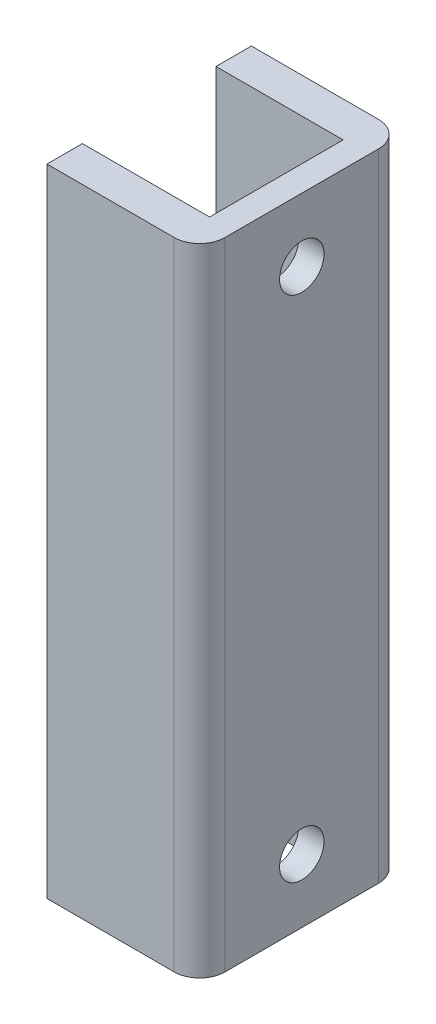
ISO-10303-21;
HEADER;
FILE_DESCRIPTION(('STEP AP214'),'2;1');
FILE_NAME('part.step','',(''),(''),'','','');
FILE_SCHEMA(('AUTOMOTIVE_DESIGN { 1 0 10303 214 1 1 1 1 }'));
ENDSEC;
DATA;
#1=APPLICATION_CONTEXT('core data for automotive mechanical design processes');
#2=APPLICATION_PROTOCOL_DEFINITION('international standard','automotive_design',2000,#1);
#3=PRODUCT_CONTEXT('',#1,'mechanical');
#4=PRODUCT('Part','Part','',(#3));
#5=PRODUCT_RELATED_PRODUCT_CATEGORY('part','',(#4));
#6=PRODUCT_DEFINITION_FORMATION('','',#4);
#7=PRODUCT_DEFINITION_CONTEXT('part definition',#1,'design');
#8=PRODUCT_DEFINITION('design','',#6,#7);
#9=PRODUCT_DEFINITION_SHAPE('','',#8);
#10=(LENGTH_UNIT() NAMED_UNIT(*) SI_UNIT(.MILLI.,.METRE.));
#11=(NAMED_UNIT(*) PLANE_ANGLE_UNIT() SI_UNIT($,.RADIAN.));
#12=(NAMED_UNIT(*) SI_UNIT($,.STERADIAN.) SOLID_ANGLE_UNIT());
#13=UNCERTAINTY_MEASURE_WITH_UNIT(LENGTH_MEASURE(1.E-05),#10,'distance_accuracy_value','');
#14=(GEOMETRIC_REPRESENTATION_CONTEXT(3) GLOBAL_UNCERTAINTY_ASSIGNED_CONTEXT((#13)) GLOBAL_UNIT_ASSIGNED_CONTEXT((#10,
#11,#12)) REPRESENTATION_CONTEXT('',''));
#15=CARTESIAN_POINT('',(0.,0.,0.));
#16=DIRECTION('',(0.,0.,1.));
#17=DIRECTION('',(1.,0.,0.));
#18=AXIS2_PLACEMENT_3D('',#15,#16,#17);
#19=CARTESIAN_POINT('',(-8.05316723468173,50.,-6.50782146287486));
#20=DIRECTION('',(1.,0.,0.));
#21=DIRECTION('',(0.,0.,-1.));
#22=AXIS2_PLACEMENT_3D('',#19,#20,#21);
#23=PLANE('',#22);
#24=DIRECTION('',(0.,0.,1.));
#25=VECTOR('',#24,1.);
#26=CARTESIAN_POINT('',(-8.05316723468173,0.,-6.50782146287486));
#27=LINE('',#26,#25);
#28=CARTESIAN_POINT('',(-8.05316723468173,0.,-9.29282146287486));
#29=VERTEX_POINT('',#28);
#30=CARTESIAN_POINT('',(-8.05316723468173,0.,-6.50782146287486));
#31=VERTEX_POINT('',#30);
#32=EDGE_CURVE('E152',#29,#31,#27,.T.);
#33=ORIENTED_EDGE('',*,*,#32,.T.);
#34=DIRECTION('',(0.,-1.,0.));
#35=VECTOR('',#34,1.);
#36=CARTESIAN_POINT('',(-8.05316723468173,50.,-6.50782146287486));
#37=LINE('',#36,#35);
#38=CARTESIAN_POINT('',(-8.05316723468173,50.,-6.50782146287486));
#39=VERTEX_POINT('',#38);
#40=EDGE_CURVE('E11',#39,#31,#37,.T.);
#41=ORIENTED_EDGE('',*,*,#40,.F.);
#42=DIRECTION('',(0.,0.,1.));
#43=VECTOR('',#42,1.);
#44=CARTESIAN_POINT('',(-8.05316723468173,50.,-6.50782146287486));
#45=LINE('',#44,#43);
#46=CARTESIAN_POINT('',(-8.05316723468173,50.,-9.29282146287486));
#47=VERTEX_POINT('',#46);
#48=EDGE_CURVE('E181',#47,#39,#45,.T.);
#49=ORIENTED_EDGE('',*,*,#48,.F.);
#50=DIRECTION('',(0.,-1.,0.));
#51=VECTOR('',#50,1.);
#52=CARTESIAN_POINT('',(-8.05316723468173,50.,-9.29282146287486));
#53=LINE('',#52,#51);
#54=EDGE_CURVE('E148',#47,#29,#53,.T.);
#55=ORIENTED_EDGE('',*,*,#54,.T.);
#56=EDGE_LOOP('',(#33,#41,#49,#55));
#57=FACE_BOUND('',#56,.T.);
#58=ADVANCED_FACE('F39',(#57),#23,.F.);
#59=CARTESIAN_POINT('',(1.94683276531827,50.,-6.50782146287486));
#60=DIRECTION('',(0.,0.,-1.));
#61=DIRECTION('',(-1.,0.,0.));
#62=AXIS2_PLACEMENT_3D('',#59,#60,#61);
#63=PLANE('',#62);
#64=DIRECTION('',(1.,0.,0.));
#65=VECTOR('',#64,1.);
#66=CARTESIAN_POINT('',(1.94683276531827,0.,-6.50782146287486));
#67=LINE('',#66,#65);
#68=CARTESIAN_POINT('',(1.94683276531827,0.,-6.50782146287486));
#69=VERTEX_POINT('',#68);
#70=EDGE_CURVE('E156',#31,#69,#67,.T.);
#71=ORIENTED_EDGE('',*,*,#70,.T.);
#72=DIRECTION('',(0.,-1.,0.));
#73=VECTOR('',#72,1.);
#74=CARTESIAN_POINT('',(1.94683276531827,50.,-6.50782146287486));
#75=LINE('',#74,#73);
#76=CARTESIAN_POINT('',(1.94683276531827,50.,-6.50782146287486));
#77=VERTEX_POINT('',#76);
#78=EDGE_CURVE('E48',#77,#69,#75,.T.);
#79=ORIENTED_EDGE('',*,*,#78,.F.);
#80=DIRECTION('',(1.,0.,0.));
#81=VECTOR('',#80,1.);
#82=CARTESIAN_POINT('',(1.94683276531827,50.,-6.50782146287486));
#83=LINE('',#82,#81);
#84=EDGE_CURVE('E105',#39,#77,#83,.T.);
#85=ORIENTED_EDGE('',*,*,#84,.F.);
#86=ORIENTED_EDGE('',*,*,#40,.T.);
#87=EDGE_LOOP('',(#71,#79,#85,#86));
#88=FACE_BOUND('',#87,.T.);
#89=ADVANCED_FACE('F275',(#88),#63,.F.);
#90=CARTESIAN_POINT('',(1.94683276531827,50.,3.99217853712514));
#91=DIRECTION('',(1.,0.,0.));
#92=DIRECTION('',(0.,0.,-1.));
#93=AXIS2_PLACEMENT_3D('',#90,#91,#92);
#94=PLANE('',#93);
#95=CARTESIAN_POINT('',(1.94683276531827,45.,-1.25782146287488));
#96=DIRECTION('',(1.,0.,0.));
#97=DIRECTION('',(0.,0.,-1.));
#98=AXIS2_PLACEMENT_3D('',#95,#96,#97);
#99=CIRCLE('',#98,1.75);
#100=CARTESIAN_POINT('',(1.94683276531827,45.,-3.00782146287488));
#101=VERTEX_POINT('',#100);
#102=EDGE_CURVE('E157',#101,#101,#99,.T.);
#103=ORIENTED_EDGE('',*,*,#102,.T.);
#104=EDGE_LOOP('',(#103));
#105=FACE_BOUND('',#104,.T.);
#106=CARTESIAN_POINT('',(1.94683276531827,5.,-1.25782146287488));
#107=DIRECTION('',(1.,0.,0.));
#108=DIRECTION('',(0.,0.,-1.));
#109=AXIS2_PLACEMENT_3D('',#106,#107,#108);
#110=CIRCLE('',#109,1.75);
#111=CARTESIAN_POINT('',(1.94683276531827,5.,-3.00782146287488));
#112=VERTEX_POINT('',#111);
#113=EDGE_CURVE('E246',#112,#112,#110,.T.);
#114=ORIENTED_EDGE('',*,*,#113,.T.);
#115=EDGE_LOOP('',(#114));
#116=FACE_BOUND('',#115,.T.);
#117=DIRECTION('',(0.,0.,1.));
#118=VECTOR('',#117,1.);
#119=CARTESIAN_POINT('',(1.94683276531827,0.,3.99217853712514));
#120=LINE('',#119,#118);
#121=CARTESIAN_POINT('',(1.94683276531827,0.,3.99217853712514));
#122=VERTEX_POINT('',#121);
#123=EDGE_CURVE('E160',#69,#122,#120,.T.);
#124=ORIENTED_EDGE('',*,*,#123,.T.);
#125=DIRECTION('',(0.,-1.,0.));
#126=VECTOR('',#125,1.);
#127=CARTESIAN_POINT('',(1.94683276531827,50.,3.99217853712514));
#128=LINE('',#127,#126);
#129=CARTESIAN_POINT('',(1.94683276531827,50.,3.99217853712514));
#130=VERTEX_POINT('',#129);
#131=EDGE_CURVE('E200',#130,#122,#128,.T.);
#132=ORIENTED_EDGE('',*,*,#131,.F.);
#133=DIRECTION('',(0.,0.,1.));
#134=VECTOR('',#133,1.);
#135=CARTESIAN_POINT('',(1.94683276531827,50.,3.99217853712514));
#136=LINE('',#135,#134);
#137=EDGE_CURVE('E210',#77,#130,#136,.T.);
#138=ORIENTED_EDGE('',*,*,#137,.F.);
#139=ORIENTED_EDGE('',*,*,#78,.T.);
#140=EDGE_LOOP('',(#124,#132,#138,#139));
#141=FACE_BOUND('',#140,.T.);
#142=ADVANCED_FACE('F208',(#105,#116,#141),#94,.F.);
#143=CARTESIAN_POINT('',(-8.05316723468173,50.,3.99217853712514));
#144=DIRECTION('',(0.,0.,1.));
#145=DIRECTION('',(1.,0.,0.));
#146=AXIS2_PLACEMENT_3D('',#143,#144,#145);
#147=PLANE('',#146);
#148=DIRECTION('',(-1.,0.,0.));
#149=VECTOR('',#148,1.);
#150=CARTESIAN_POINT('',(-8.05316723468173,0.,3.99217853712514));
#151=LINE('',#150,#149);
#152=CARTESIAN_POINT('',(-8.05316723468173,0.,3.99217853712514));
#153=VERTEX_POINT('',#152);
#154=EDGE_CURVE('E163',#122,#153,#151,.T.);
#155=ORIENTED_EDGE('',*,*,#154,.T.);
#156=DIRECTION('',(0.,-1.,0.));
#157=VECTOR('',#156,1.);
#158=CARTESIAN_POINT('',(-8.05316723468173,50.,3.99217853712514));
#159=LINE('',#158,#157);
#160=CARTESIAN_POINT('',(-8.05316723468173,50.,3.99217853712514));
#161=VERTEX_POINT('',#160);
#162=EDGE_CURVE('E196',#161,#153,#159,.T.);
#163=ORIENTED_EDGE('',*,*,#162,.F.);
#164=DIRECTION('',(-1.,0.,0.));
#165=VECTOR('',#164,1.);
#166=CARTESIAN_POINT('',(-8.05316723468173,50.,3.99217853712514));
#167=LINE('',#166,#165);
#168=EDGE_CURVE('E229',#130,#161,#167,.T.);
#169=ORIENTED_EDGE('',*,*,#168,.F.);
#170=ORIENTED_EDGE('',*,*,#131,.T.);
#171=EDGE_LOOP('',(#155,#163,#169,#170));
#172=FACE_BOUND('',#171,.T.);
#173=ADVANCED_FACE('F219',(#172),#147,.F.);
#174=CARTESIAN_POINT('',(-8.05316723468173,50.,6.77717853712514));
#175=DIRECTION('',(1.,0.,0.));
#176=DIRECTION('',(0.,0.,-1.));
#177=AXIS2_PLACEMENT_3D('',#174,#175,#176);
#178=PLANE('',#177);
#179=DIRECTION('',(0.,0.,1.));
#180=VECTOR('',#179,1.);
#181=CARTESIAN_POINT('',(-8.05316723468173,0.,6.77717853712514));
#182=LINE('',#181,#180);
#183=CARTESIAN_POINT('',(-8.05316723468173,0.,6.77717853712514));
#184=VERTEX_POINT('',#183);
#185=EDGE_CURVE('E166',#153,#184,#182,.T.);
#186=ORIENTED_EDGE('',*,*,#185,.T.);
#187=DIRECTION('',(0.,-1.,0.));
#188=VECTOR('',#187,1.);
#189=CARTESIAN_POINT('',(-8.05316723468173,50.,6.77717853712514));
#190=LINE('',#189,#188);
#191=CARTESIAN_POINT('',(-8.05316723468173,50.,6.77717853712514));
#192=VERTEX_POINT('',#191);
#193=EDGE_CURVE('E192',#192,#184,#190,.T.);
#194=ORIENTED_EDGE('',*,*,#193,.F.);
#195=DIRECTION('',(0.,0.,1.));
#196=VECTOR('',#195,1.);
#197=CARTESIAN_POINT('',(-8.05316723468173,50.,6.77717853712514));
#198=LINE('',#197,#196);
#199=EDGE_CURVE('E225',#161,#192,#198,.T.);
#200=ORIENTED_EDGE('',*,*,#199,.F.);
#201=ORIENTED_EDGE('',*,*,#162,.T.);
#202=EDGE_LOOP('',(#186,#194,#200,#201));
#203=FACE_BOUND('',#202,.T.);
#204=ADVANCED_FACE('F223',(#203),#178,.F.);
#205=CARTESIAN_POINT('',(1.94683276531826,50.,6.77717853712514));
#206=DIRECTION('',(0.,0.,-1.));
#207=DIRECTION('',(-1.,0.,0.));
#208=AXIS2_PLACEMENT_3D('',#205,#206,#207);
#209=PLANE('',#208);
#210=DIRECTION('',(1.,0.,0.));
#211=VECTOR('',#210,1.);
#212=CARTESIAN_POINT('',(1.94683276531826,0.,6.77717853712514));
#213=LINE('',#212,#211);
#214=CARTESIAN_POINT('',(1.94683276531826,0.,6.77717853712514));
#215=VERTEX_POINT('',#214);
#216=EDGE_CURVE('E169',#184,#215,#213,.T.);
#217=ORIENTED_EDGE('',*,*,#216,.T.);
#218=DIRECTION('',(0.,-1.,0.));
#219=VECTOR('',#218,1.);
#220=CARTESIAN_POINT('',(1.94683276531826,50.,6.77717853712514));
#221=LINE('',#220,#219);
#222=CARTESIAN_POINT('',(1.94683276531826,50.,6.77717853712514));
#223=VERTEX_POINT('',#222);
#224=EDGE_CURVE('E188',#223,#215,#221,.T.);
#225=ORIENTED_EDGE('',*,*,#224,.F.);
#226=DIRECTION('',(1.,0.,0.));
#227=VECTOR('',#226,1.);
#228=CARTESIAN_POINT('',(1.94683276531826,50.,6.77717853712514));
#229=LINE('',#228,#227);
#230=EDGE_CURVE('E228',#192,#223,#229,.T.);
#231=ORIENTED_EDGE('',*,*,#230,.F.);
#232=ORIENTED_EDGE('',*,*,#193,.T.);
#233=EDGE_LOOP('',(#217,#225,#231,#232));
#234=FACE_BOUND('',#233,.T.);
#235=ADVANCED_FACE('F293',(#234),#209,.F.);
#236=CARTESIAN_POINT('',(1.94683276531827,50.,4.77717853712514));
#237=DIRECTION('',(0.,-1.,0.));
#238=DIRECTION('',(0.,0.,-1.));
#239=AXIS2_PLACEMENT_3D('',#236,#237,#238);
#240=CYLINDRICAL_SURFACE('',#239,2.);
#241=CARTESIAN_POINT('',(1.94683276531827,0.,4.77717853712514));
#242=DIRECTION('',(0.,1.,0.));
#243=DIRECTION('',(0.,0.,-1.));
#244=AXIS2_PLACEMENT_3D('',#241,#242,#243);
#245=CIRCLE('',#244,2.);
#246=CARTESIAN_POINT('',(3.94683276531827,0.,4.77717853712512));
#247=VERTEX_POINT('',#246);
#248=EDGE_CURVE('E172',#215,#247,#245,.T.);
#249=ORIENTED_EDGE('',*,*,#248,.T.);
#250=DIRECTION('',(0.,-1.,0.));
#251=VECTOR('',#250,1.);
#252=CARTESIAN_POINT('',(3.94683276531827,50.,4.77717853712512));
#253=LINE('',#252,#251);
#254=CARTESIAN_POINT('',(3.94683276531827,50.,4.77717853712512));
#255=VERTEX_POINT('',#254);
#256=EDGE_CURVE('E141',#255,#247,#253,.T.);
#257=ORIENTED_EDGE('',*,*,#256,.F.);
#258=CARTESIAN_POINT('',(1.94683276531827,50.,4.77717853712514));
#259=DIRECTION('',(0.,1.,0.));
#260=DIRECTION('',(0.,0.,-1.));
#261=AXIS2_PLACEMENT_3D('',#258,#259,#260);
#262=CIRCLE('',#261,2.);
#263=EDGE_CURVE('E130',#223,#255,#262,.T.);
#264=ORIENTED_EDGE('',*,*,#263,.F.);
#265=ORIENTED_EDGE('',*,*,#224,.T.);
#266=EDGE_LOOP('',(#249,#257,#264,#265));
#267=FACE_BOUND('',#266,.T.);
#268=ADVANCED_FACE('F264',(#267),#240,.T.);
#269=CARTESIAN_POINT('',(3.94683276531827,50.,-7.29282146287485));
#270=DIRECTION('',(-1.,0.,0.));
#271=DIRECTION('',(0.,0.,1.));
#272=AXIS2_PLACEMENT_3D('',#269,#270,#271);
#273=PLANE('',#272);
#274=CARTESIAN_POINT('',(3.94683276531827,45.,-1.25782146287488));
#275=DIRECTION('',(1.,0.,0.));
#276=DIRECTION('',(0.,0.,-1.));
#277=AXIS2_PLACEMENT_3D('',#274,#275,#276);
#278=CIRCLE('',#277,1.75);
#279=CARTESIAN_POINT('',(3.94683276531827,45.,-3.00782146287488));
#280=VERTEX_POINT('',#279);
#281=EDGE_CURVE('E250',#280,#280,#278,.T.);
#282=ORIENTED_EDGE('',*,*,#281,.F.);
#283=EDGE_LOOP('',(#282));
#284=FACE_BOUND('',#283,.T.);
#285=CARTESIAN_POINT('',(3.94683276531827,5.,-1.25782146287488));
#286=DIRECTION('',(1.,0.,0.));
#287=DIRECTION('',(0.,0.,-1.));
#288=AXIS2_PLACEMENT_3D('',#285,#286,#287);
#289=CIRCLE('',#288,1.75);
#290=CARTESIAN_POINT('',(3.94683276531827,5.,-3.00782146287488));
#291=VERTEX_POINT('',#290);
#292=EDGE_CURVE('E251',#291,#291,#289,.T.);
#293=ORIENTED_EDGE('',*,*,#292,.F.);
#294=EDGE_LOOP('',(#293));
#295=FACE_BOUND('',#294,.T.);
#296=DIRECTION('',(0.,0.,-1.));
#297=VECTOR('',#296,1.);
#298=CARTESIAN_POINT('',(3.94683276531827,0.,-7.29282146287485));
#299=LINE('',#298,#297);
#300=CARTESIAN_POINT('',(3.94683276531827,0.,-7.29282146287485));
#301=VERTEX_POINT('',#300);
#302=EDGE_CURVE('E139',#247,#301,#299,.T.);
#303=ORIENTED_EDGE('',*,*,#302,.T.);
#304=DIRECTION('',(0.,-1.,0.));
#305=VECTOR('',#304,1.);
#306=CARTESIAN_POINT('',(3.94683276531827,50.,-7.29282146287485));
#307=LINE('',#306,#305);
#308=CARTESIAN_POINT('',(3.94683276531827,50.,-7.29282146287485));
#309=VERTEX_POINT('',#308);
#310=EDGE_CURVE('E136',#309,#301,#307,.T.);
#311=ORIENTED_EDGE('',*,*,#310,.F.);
#312=DIRECTION('',(0.,0.,-1.));
#313=VECTOR('',#312,1.);
#314=CARTESIAN_POINT('',(3.94683276531827,50.,-7.29282146287485));
#315=LINE('',#314,#313);
#316=EDGE_CURVE('E124',#255,#309,#315,.T.);
#317=ORIENTED_EDGE('',*,*,#316,.F.);
#318=ORIENTED_EDGE('',*,*,#256,.T.);
#319=EDGE_LOOP('',(#303,#311,#317,#318));
#320=FACE_BOUND('',#319,.T.);
#321=ADVANCED_FACE('F137',(#284,#295,#320),#273,.F.);
#322=CARTESIAN_POINT('',(1.94683276531827,50.,-7.29282146287486));
#323=DIRECTION('',(0.,-1.,0.));
#324=DIRECTION('',(0.,0.,-1.));
#325=AXIS2_PLACEMENT_3D('',#322,#323,#324);
#326=CYLINDRICAL_SURFACE('',#325,2.);
#327=CARTESIAN_POINT('',(1.94683276531827,0.,-7.29282146287486));
#328=DIRECTION('',(0.,1.,0.));
#329=DIRECTION('',(0.,0.,-1.));
#330=AXIS2_PLACEMENT_3D('',#327,#328,#329);
#331=CIRCLE('',#330,2.);
#332=CARTESIAN_POINT('',(1.94683276531826,0.,-9.29282146287486));
#333=VERTEX_POINT('',#332);
#334=EDGE_CURVE('E91',#301,#333,#331,.T.);
#335=ORIENTED_EDGE('',*,*,#334,.T.);
#336=DIRECTION('',(0.,-1.,0.));
#337=VECTOR('',#336,1.);
#338=CARTESIAN_POINT('',(1.94683276531826,50.,-9.29282146287486));
#339=LINE('',#338,#337);
#340=CARTESIAN_POINT('',(1.94683276531826,50.,-9.29282146287486));
#341=VERTEX_POINT('',#340);
#342=EDGE_CURVE('E142',#341,#333,#339,.T.);
#343=ORIENTED_EDGE('',*,*,#342,.F.);
#344=CARTESIAN_POINT('',(1.94683276531827,50.,-7.29282146287486));
#345=DIRECTION('',(0.,1.,0.));
#346=DIRECTION('',(0.,0.,-1.));
#347=AXIS2_PLACEMENT_3D('',#344,#345,#346);
#348=CIRCLE('',#347,2.);
#349=EDGE_CURVE('E128',#309,#341,#348,.T.);
#350=ORIENTED_EDGE('',*,*,#349,.F.);
#351=ORIENTED_EDGE('',*,*,#310,.T.);
#352=EDGE_LOOP('',(#335,#343,#350,#351));
#353=FACE_BOUND('',#352,.T.);
#354=ADVANCED_FACE('F144',(#353),#326,.T.);
#355=CARTESIAN_POINT('',(-8.05316723468173,50.,-9.29282146287486));
#356=DIRECTION('',(0.,0.,1.));
#357=DIRECTION('',(1.,0.,0.));
#358=AXIS2_PLACEMENT_3D('',#355,#356,#357);
#359=PLANE('',#358);
#360=DIRECTION('',(-1.,0.,0.));
#361=VECTOR('',#360,1.);
#362=CARTESIAN_POINT('',(-8.05316723468173,0.,-9.29282146287486));
#363=LINE('',#362,#361);
#364=EDGE_CURVE('E97',#333,#29,#363,.T.);
#365=ORIENTED_EDGE('',*,*,#364,.T.);
#366=ORIENTED_EDGE('',*,*,#54,.F.);
#367=DIRECTION('',(-1.,0.,0.));
#368=VECTOR('',#367,1.);
#369=CARTESIAN_POINT('',(-8.05316723468173,50.,-9.29282146287486));
#370=LINE('',#369,#368);
#371=EDGE_CURVE('E56',#341,#47,#370,.T.);
#372=ORIENTED_EDGE('',*,*,#371,.F.);
#373=ORIENTED_EDGE('',*,*,#342,.T.);
#374=EDGE_LOOP('',(#365,#366,#372,#373));
#375=FACE_BOUND('',#374,.T.);
#376=ADVANCED_FACE('F305',(#375),#359,.F.);
#377=CARTESIAN_POINT('',(1.94683276531827,50.,-7.29282146287486));
#378=DIRECTION('',(0.,-1.,0.));
#379=DIRECTION('',(0.,0.,-1.));
#380=AXIS2_PLACEMENT_3D('',#377,#378,#379);
#381=PLANE('',#380);
#382=ORIENTED_EDGE('',*,*,#48,.T.);
#383=ORIENTED_EDGE('',*,*,#84,.T.);
#384=ORIENTED_EDGE('',*,*,#137,.T.);
#385=ORIENTED_EDGE('',*,*,#168,.T.);
#386=ORIENTED_EDGE('',*,*,#199,.T.);
#387=ORIENTED_EDGE('',*,*,#230,.T.);
#388=ORIENTED_EDGE('',*,*,#263,.T.);
#389=ORIENTED_EDGE('',*,*,#316,.T.);
#390=ORIENTED_EDGE('',*,*,#349,.T.);
#391=ORIENTED_EDGE('',*,*,#371,.T.);
#392=EDGE_LOOP('',(#382,#383,#384,#385,#386,#387,#388,#389,#390,#391));
#393=FACE_BOUND('',#392,.T.);
#394=ADVANCED_FACE('F126',(#393),#381,.F.);
#395=CARTESIAN_POINT('',(1.94683276531827,0.,-7.29282146287486));
#396=DIRECTION('',(0.,-1.,0.));
#397=DIRECTION('',(0.,0.,-1.));
#398=AXIS2_PLACEMENT_3D('',#395,#396,#397);
#399=PLANE('',#398);
#400=ORIENTED_EDGE('',*,*,#32,.F.);
#401=ORIENTED_EDGE('',*,*,#364,.F.);
#402=ORIENTED_EDGE('',*,*,#334,.F.);
#403=ORIENTED_EDGE('',*,*,#302,.F.);
#404=ORIENTED_EDGE('',*,*,#248,.F.);
#405=ORIENTED_EDGE('',*,*,#216,.F.);
#406=ORIENTED_EDGE('',*,*,#185,.F.);
#407=ORIENTED_EDGE('',*,*,#154,.F.);
#408=ORIENTED_EDGE('',*,*,#123,.F.);
#409=ORIENTED_EDGE('',*,*,#70,.F.);
#410=EDGE_LOOP('',(#400,#401,#402,#403,#404,#405,#406,#407,#408,#409));
#411=FACE_BOUND('',#410,.T.);
#412=ADVANCED_FACE('F214',(#411),#399,.T.);
#413=CARTESIAN_POINT('',(-8.05316723468173,5.,-1.25782146287487));
#414=DIRECTION('',(1.,0.,0.));
#415=DIRECTION('',(0.,0.,-1.));
#416=AXIS2_PLACEMENT_3D('',#413,#414,#415);
#417=CYLINDRICAL_SURFACE('',#416,1.75);
#418=CARTESIAN_POINT('',(3.94683276531827,5.,-3.00782146287488));
#419=CARTESIAN_POINT('',(3.92599943198494,5.,-3.00782146287488));
#420=CARTESIAN_POINT('',(3.90516609865161,5.,-3.00782146287488));
#421=CARTESIAN_POINT('',(3.86349943198494,5.,-3.00782146287488));
#422=CARTESIAN_POINT('',(3.84266609865161,5.,-3.00782146287488));
#423=CARTESIAN_POINT('',(3.80099943198494,5.,-3.00782146287488));
#424=CARTESIAN_POINT('',(3.78016609865161,5.,-3.00782146287488));
#425=CARTESIAN_POINT('',(3.73849943198494,5.,-3.00782146287488));
#426=CARTESIAN_POINT('',(3.71766609865161,5.,-3.00782146287488));
#427=CARTESIAN_POINT('',(3.67599943198494,5.,-3.00782146287488));
#428=CARTESIAN_POINT('',(3.65516609865161,5.,-3.00782146287488));
#429=CARTESIAN_POINT('',(3.61349943198494,5.,-3.00782146287488));
#430=CARTESIAN_POINT('',(3.59266609865161,5.,-3.00782146287488));
#431=CARTESIAN_POINT('',(3.55099943198494,5.,-3.00782146287488));
#432=CARTESIAN_POINT('',(3.53016609865161,5.,-3.00782146287488));
#433=CARTESIAN_POINT('',(3.48849943198494,5.,-3.00782146287488));
#434=CARTESIAN_POINT('',(3.46766609865161,5.,-3.00782146287488));
#435=CARTESIAN_POINT('',(3.42599943198494,5.,-3.00782146287488));
#436=CARTESIAN_POINT('',(3.40516609865161,5.,-3.00782146287488));
#437=CARTESIAN_POINT('',(3.36349943198494,5.,-3.00782146287488));
#438=CARTESIAN_POINT('',(3.34266609865161,5.,-3.00782146287488));
#439=CARTESIAN_POINT('',(3.30099943198494,5.,-3.00782146287488));
#440=CARTESIAN_POINT('',(3.28016609865161,5.,-3.00782146287488));
#441=CARTESIAN_POINT('',(3.23849943198494,5.,-3.00782146287488));
#442=CARTESIAN_POINT('',(3.21766609865161,5.,-3.00782146287488));
#443=CARTESIAN_POINT('',(3.17599943198494,5.,-3.00782146287488));
#444=CARTESIAN_POINT('',(3.15516609865161,5.,-3.00782146287488));
#445=CARTESIAN_POINT('',(3.11349943198494,5.,-3.00782146287488));
#446=CARTESIAN_POINT('',(3.09266609865161,5.,-3.00782146287488));
#447=CARTESIAN_POINT('',(3.05099943198494,5.,-3.00782146287488));
#448=CARTESIAN_POINT('',(3.03016609865161,5.,-3.00782146287488));
#449=CARTESIAN_POINT('',(2.98849943198494,5.,-3.00782146287488));
#450=CARTESIAN_POINT('',(2.96766609865161,5.,-3.00782146287488));
#451=CARTESIAN_POINT('',(2.92599943198494,5.,-3.00782146287488));
#452=CARTESIAN_POINT('',(2.90516609865161,5.,-3.00782146287488));
#453=CARTESIAN_POINT('',(2.86349943198494,5.,-3.00782146287488));
#454=CARTESIAN_POINT('',(2.84266609865161,5.,-3.00782146287488));
#455=CARTESIAN_POINT('',(2.80099943198494,5.,-3.00782146287488));
#456=CARTESIAN_POINT('',(2.78016609865161,5.,-3.00782146287488));
#457=CARTESIAN_POINT('',(2.73849943198494,5.,-3.00782146287488));
#458=CARTESIAN_POINT('',(2.71766609865161,5.,-3.00782146287488));
#459=CARTESIAN_POINT('',(2.67599943198494,5.,-3.00782146287488));
#460=CARTESIAN_POINT('',(2.65516609865161,5.,-3.00782146287488));
#461=CARTESIAN_POINT('',(2.61349943198494,5.,-3.00782146287488));
#462=CARTESIAN_POINT('',(2.59266609865161,5.,-3.00782146287488));
#463=CARTESIAN_POINT('',(2.55099943198494,5.,-3.00782146287488));
#464=CARTESIAN_POINT('',(2.53016609865161,5.,-3.00782146287488));
#465=CARTESIAN_POINT('',(2.48849943198494,5.,-3.00782146287488));
#466=CARTESIAN_POINT('',(2.46766609865161,5.,-3.00782146287488));
#467=CARTESIAN_POINT('',(2.42599943198494,5.,-3.00782146287488));
#468=CARTESIAN_POINT('',(2.40516609865161,5.,-3.00782146287488));
#469=CARTESIAN_POINT('',(2.36349943198494,5.,-3.00782146287488));
#470=CARTESIAN_POINT('',(2.34266609865161,5.,-3.00782146287488));
#471=CARTESIAN_POINT('',(2.30099943198494,5.,-3.00782146287488));
#472=CARTESIAN_POINT('',(2.28016609865161,5.,-3.00782146287488));
#473=CARTESIAN_POINT('',(2.23849943198494,5.,-3.00782146287488));
#474=CARTESIAN_POINT('',(2.2176660986516,5.,-3.00782146287488));
#475=CARTESIAN_POINT('',(2.17599943198494,5.,-3.00782146287488));
#476=CARTESIAN_POINT('',(2.1551660986516,5.,-3.00782146287488));
#477=CARTESIAN_POINT('',(2.11349943198494,5.,-3.00782146287488));
#478=CARTESIAN_POINT('',(2.0926660986516,5.,-3.00782146287488));
#479=CARTESIAN_POINT('',(2.05099943198494,5.,-3.00782146287488));
#480=CARTESIAN_POINT('',(2.0301660986516,5.,-3.00782146287488));
#481=CARTESIAN_POINT('',(1.98849943198494,5.,-3.00782146287488));
#482=CARTESIAN_POINT('',(1.9676660986516,5.,-3.00782146287488));
#483=CARTESIAN_POINT('',(1.94683276531827,5.,-3.00782146287488));
#484=B_SPLINE_CURVE_WITH_KNOTS('',3,(#418,#419,#420,#421,#422,#423,#424,#425,#426,#427,#428,
#429,#430,#431,#432,#433,#434,#435,#436,#437,#438,#439,#440,#441,#442,#443,#444,#445,#446,#447,
#448,#449,#450,#451,#452,#453,#454,#455,#456,#457,#458,#459,#460,#461,#462,#463,#464,#465,#466,
#467,#468,#469,#470,#471,#472,#473,#474,#475,#476,#477,#478,#479,#480,#481,#482,#483),
.UNSPECIFIED.,.F.,.F.,(4,2,2,2,2,2,2,2,2,2,2,2,2,2,2,2,2,2,2,2,2,2,2,2,2,2,2,2,2,2,2,2,4),(0.,
0.0625000000000001,0.125,0.1875,0.25,0.3125,0.375,0.4375,0.5,0.5625,0.625000000000001,
0.687500000000001,0.750000000000001,0.812500000000001,0.875000000000001,0.937500000000001,1.,
1.0625,1.125,1.1875,1.25,1.3125,1.375,1.4375,1.5,1.5625,1.625,1.6875,1.75,1.8125,1.875,1.9375,
2.),.UNSPECIFIED.);
#485=EDGE_CURVE('BSEAM268',#291,#112,#484,.T.);
#486=ORIENTED_EDGE('',*,*,#292,.T.);
#487=ORIENTED_EDGE('',*,*,#113,.F.);
#488=ORIENTED_EDGE('',*,*,#485,.T.);
#489=ORIENTED_EDGE('',*,*,#485,.F.);
#490=EDGE_LOOP('',(#486,#488,#487,#489));
#491=FACE_BOUND('',#490,.T.);
#492=ADVANCED_FACE('F268',(#491),#417,.F.);
#493=CARTESIAN_POINT('',(-8.05316723468173,45.,-1.25782146287487));
#494=DIRECTION('',(1.,0.,0.));
#495=DIRECTION('',(0.,0.,-1.));
#496=AXIS2_PLACEMENT_3D('',#493,#494,#495);
#497=CYLINDRICAL_SURFACE('',#496,1.75);
#498=CARTESIAN_POINT('',(3.94683276531827,45.,-3.00782146287488));
#499=CARTESIAN_POINT('',(3.92599943198494,45.,-3.00782146287488));
#500=CARTESIAN_POINT('',(3.90516609865161,45.,-3.00782146287488));
#501=CARTESIAN_POINT('',(3.86349943198494,45.,-3.00782146287488));
#502=CARTESIAN_POINT('',(3.84266609865161,45.,-3.00782146287488));
#503=CARTESIAN_POINT('',(3.80099943198494,45.,-3.00782146287488));
#504=CARTESIAN_POINT('',(3.78016609865161,45.,-3.00782146287488));
#505=CARTESIAN_POINT('',(3.73849943198494,45.,-3.00782146287488));
#506=CARTESIAN_POINT('',(3.71766609865161,45.,-3.00782146287488));
#507=CARTESIAN_POINT('',(3.67599943198494,45.,-3.00782146287488));
#508=CARTESIAN_POINT('',(3.65516609865161,45.,-3.00782146287488));
#509=CARTESIAN_POINT('',(3.61349943198494,45.,-3.00782146287488));
#510=CARTESIAN_POINT('',(3.59266609865161,45.,-3.00782146287488));
#511=CARTESIAN_POINT('',(3.55099943198494,45.,-3.00782146287488));
#512=CARTESIAN_POINT('',(3.53016609865161,45.,-3.00782146287488));
#513=CARTESIAN_POINT('',(3.48849943198494,45.,-3.00782146287488));
#514=CARTESIAN_POINT('',(3.46766609865161,45.,-3.00782146287488));
#515=CARTESIAN_POINT('',(3.42599943198494,45.,-3.00782146287488));
#516=CARTESIAN_POINT('',(3.40516609865161,45.,-3.00782146287488));
#517=CARTESIAN_POINT('',(3.36349943198494,45.,-3.00782146287488));
#518=CARTESIAN_POINT('',(3.34266609865161,45.,-3.00782146287488));
#519=CARTESIAN_POINT('',(3.30099943198494,45.,-3.00782146287488));
#520=CARTESIAN_POINT('',(3.28016609865161,45.,-3.00782146287488));
#521=CARTESIAN_POINT('',(3.23849943198494,45.,-3.00782146287488));
#522=CARTESIAN_POINT('',(3.21766609865161,45.,-3.00782146287488));
#523=CARTESIAN_POINT('',(3.17599943198494,45.,-3.00782146287488));
#524=CARTESIAN_POINT('',(3.15516609865161,45.,-3.00782146287488));
#525=CARTESIAN_POINT('',(3.11349943198494,45.,-3.00782146287488));
#526=CARTESIAN_POINT('',(3.09266609865161,45.,-3.00782146287488));
#527=CARTESIAN_POINT('',(3.05099943198494,45.,-3.00782146287488));
#528=CARTESIAN_POINT('',(3.03016609865161,45.,-3.00782146287488));
#529=CARTESIAN_POINT('',(2.98849943198494,45.,-3.00782146287488));
#530=CARTESIAN_POINT('',(2.96766609865161,45.,-3.00782146287488));
#531=CARTESIAN_POINT('',(2.92599943198494,45.,-3.00782146287488));
#532=CARTESIAN_POINT('',(2.90516609865161,45.,-3.00782146287488));
#533=CARTESIAN_POINT('',(2.86349943198494,45.,-3.00782146287488));
#534=CARTESIAN_POINT('',(2.84266609865161,45.,-3.00782146287488));
#535=CARTESIAN_POINT('',(2.80099943198494,45.,-3.00782146287488));
#536=CARTESIAN_POINT('',(2.78016609865161,45.,-3.00782146287488));
#537=CARTESIAN_POINT('',(2.73849943198494,45.,-3.00782146287488));
#538=CARTESIAN_POINT('',(2.71766609865161,45.,-3.00782146287488));
#539=CARTESIAN_POINT('',(2.67599943198494,45.,-3.00782146287488));
#540=CARTESIAN_POINT('',(2.65516609865161,45.,-3.00782146287488));
#541=CARTESIAN_POINT('',(2.61349943198494,45.,-3.00782146287488));
#542=CARTESIAN_POINT('',(2.59266609865161,45.,-3.00782146287488));
#543=CARTESIAN_POINT('',(2.55099943198494,45.,-3.00782146287488));
#544=CARTESIAN_POINT('',(2.53016609865161,45.,-3.00782146287488));
#545=CARTESIAN_POINT('',(2.48849943198494,45.,-3.00782146287488));
#546=CARTESIAN_POINT('',(2.46766609865161,45.,-3.00782146287488));
#547=CARTESIAN_POINT('',(2.42599943198494,45.,-3.00782146287488));
#548=CARTESIAN_POINT('',(2.40516609865161,45.,-3.00782146287488));
#549=CARTESIAN_POINT('',(2.36349943198494,45.,-3.00782146287488));
#550=CARTESIAN_POINT('',(2.34266609865161,45.,-3.00782146287488));
#551=CARTESIAN_POINT('',(2.30099943198494,45.,-3.00782146287488));
#552=CARTESIAN_POINT('',(2.28016609865161,45.,-3.00782146287488));
#553=CARTESIAN_POINT('',(2.23849943198494,45.,-3.00782146287488));
#554=CARTESIAN_POINT('',(2.2176660986516,45.,-3.00782146287488));
#555=CARTESIAN_POINT('',(2.17599943198494,45.,-3.00782146287488));
#556=CARTESIAN_POINT('',(2.1551660986516,45.,-3.00782146287488));
#557=CARTESIAN_POINT('',(2.11349943198494,45.,-3.00782146287488));
#558=CARTESIAN_POINT('',(2.0926660986516,45.,-3.00782146287488));
#559=CARTESIAN_POINT('',(2.05099943198494,45.,-3.00782146287488));
#560=CARTESIAN_POINT('',(2.0301660986516,45.,-3.00782146287488));
#561=CARTESIAN_POINT('',(1.98849943198494,45.,-3.00782146287488));
#562=CARTESIAN_POINT('',(1.9676660986516,45.,-3.00782146287488));
#563=CARTESIAN_POINT('',(1.94683276531827,45.,-3.00782146287488));
#564=B_SPLINE_CURVE_WITH_KNOTS('',3,(#498,#499,#500,#501,#502,#503,#504,#505,#506,#507,#508,
#509,#510,#511,#512,#513,#514,#515,#516,#517,#518,#519,#520,#521,#522,#523,#524,#525,#526,#527,
#528,#529,#530,#531,#532,#533,#534,#535,#536,#537,#538,#539,#540,#541,#542,#543,#544,#545,#546,
#547,#548,#549,#550,#551,#552,#553,#554,#555,#556,#557,#558,#559,#560,#561,#562,#563),
.UNSPECIFIED.,.F.,.F.,(4,2,2,2,2,2,2,2,2,2,2,2,2,2,2,2,2,2,2,2,2,2,2,2,2,2,2,2,2,2,2,2,4),(0.,
0.0625000000000001,0.125,0.1875,0.25,0.3125,0.375,0.4375,0.5,0.5625,0.625000000000001,
0.687500000000001,0.750000000000001,0.812500000000001,0.875000000000001,0.937500000000001,1.,
1.0625,1.125,1.1875,1.25,1.3125,1.375,1.4375,1.5,1.5625,1.625,1.6875,1.75,1.8125,1.875,1.9375,
2.),.UNSPECIFIED.);
#565=EDGE_CURVE('BSEAM259',#280,#101,#564,.T.);
#566=ORIENTED_EDGE('',*,*,#281,.T.);
#567=ORIENTED_EDGE('',*,*,#102,.F.);
#568=ORIENTED_EDGE('',*,*,#565,.T.);
#569=ORIENTED_EDGE('',*,*,#565,.F.);
#570=EDGE_LOOP('',(#566,#568,#567,#569));
#571=FACE_BOUND('',#570,.T.);
#572=ADVANCED_FACE('F259',(#571),#497,.F.);
#573=CLOSED_SHELL('',(#58,#89,#142,#173,#204,#235,#268,#321,#354,#376,#394,#412,#492,#572));
#574=MANIFOLD_SOLID_BREP('B2',#573);
#575=ADVANCED_BREP_SHAPE_REPRESENTATION('',(#18,#574),#14);
#576=SHAPE_DEFINITION_REPRESENTATION(#9,#575);
ENDSEC;
END-ISO-10303-21;
